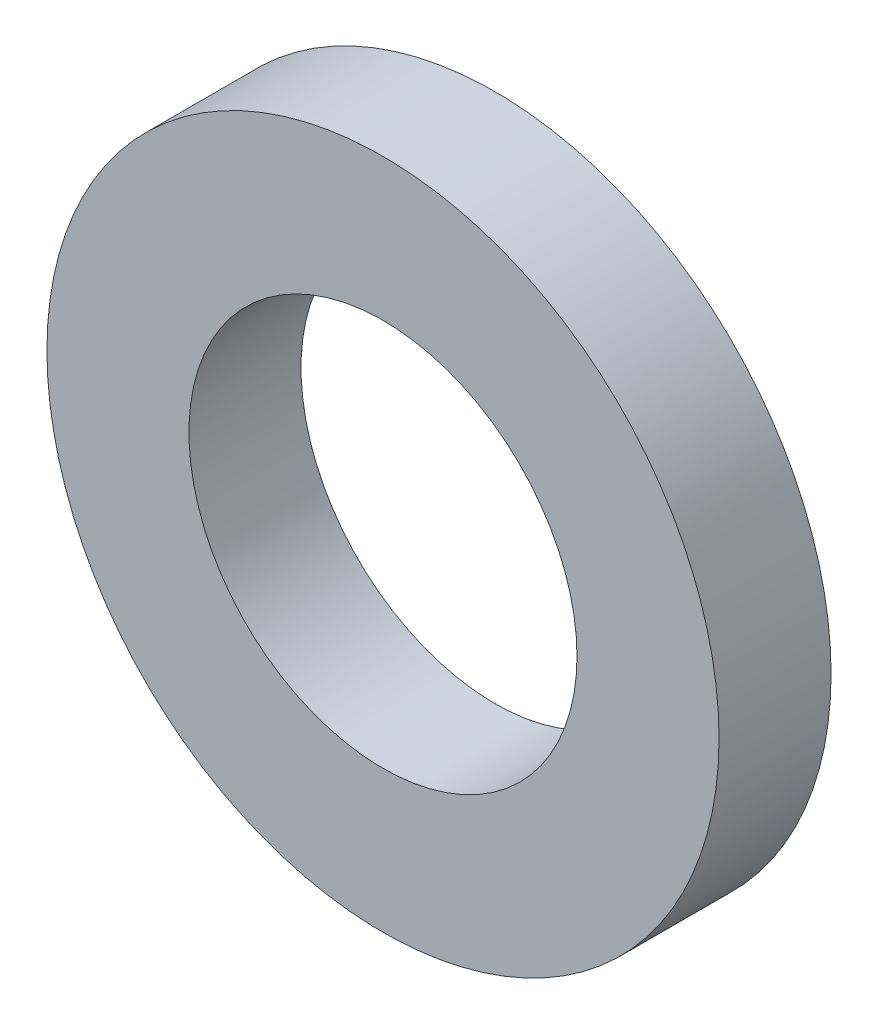
ISO-10303-21;
HEADER;
FILE_DESCRIPTION(('STEP AP214'),'2;1');
FILE_NAME('part.step','',(''),(''),'','','');
FILE_SCHEMA(('AUTOMOTIVE_DESIGN { 1 0 10303 214 1 1 1 1 }'));
ENDSEC;
DATA;
#1=APPLICATION_CONTEXT('core data for automotive mechanical design processes');
#2=APPLICATION_PROTOCOL_DEFINITION('international standard','automotive_design',2000,#1);
#3=PRODUCT_CONTEXT('',#1,'mechanical');
#4=PRODUCT('Part','Part','',(#3));
#5=PRODUCT_RELATED_PRODUCT_CATEGORY('part','',(#4));
#6=PRODUCT_DEFINITION_FORMATION('','',#4);
#7=PRODUCT_DEFINITION_CONTEXT('part definition',#1,'design');
#8=PRODUCT_DEFINITION('design','',#6,#7);
#9=PRODUCT_DEFINITION_SHAPE('','',#8);
#10=(LENGTH_UNIT() NAMED_UNIT(*) SI_UNIT(.MILLI.,.METRE.));
#11=(NAMED_UNIT(*) PLANE_ANGLE_UNIT() SI_UNIT($,.RADIAN.));
#12=(NAMED_UNIT(*) SI_UNIT($,.STERADIAN.) SOLID_ANGLE_UNIT());
#13=UNCERTAINTY_MEASURE_WITH_UNIT(LENGTH_MEASURE(1.E-05),#10,'distance_accuracy_value','');
#14=(GEOMETRIC_REPRESENTATION_CONTEXT(3) GLOBAL_UNCERTAINTY_ASSIGNED_CONTEXT((#13)) GLOBAL_UNIT_ASSIGNED_CONTEXT((#10,
#11,#12)) REPRESENTATION_CONTEXT('',''));
#15=CARTESIAN_POINT('',(0.,0.,0.));
#16=DIRECTION('',(0.,0.,1.));
#17=DIRECTION('',(1.,0.,0.));
#18=AXIS2_PLACEMENT_3D('',#15,#16,#17);
#19=CARTESIAN_POINT('',(0.,0.,3.175));
#20=DIRECTION('',(0.,0.,-1.));
#21=DIRECTION('',(-1.,0.,0.));
#22=AXIS2_PLACEMENT_3D('',#19,#20,#21);
#23=CYLINDRICAL_SURFACE('',#22,19.05);
#24=CARTESIAN_POINT('',(0.,0.,3.175));
#25=DIRECTION('',(0.,0.,1.));
#26=DIRECTION('',(1.,0.,0.));
#27=AXIS2_PLACEMENT_3D('',#24,#25,#26);
#28=CIRCLE('',#27,19.05);
#29=CARTESIAN_POINT('',(19.05,0.,3.175));
#30=VERTEX_POINT('',#29);
#31=EDGE_CURVE('E10',#30,#30,#28,.T.);
#32=ORIENTED_EDGE('',*,*,#31,.F.);
#33=EDGE_LOOP('',(#32));
#34=FACE_BOUND('',#33,.T.);
#35=CARTESIAN_POINT('',(0.,0.,-3.175));
#36=DIRECTION('',(0.,0.,1.));
#37=DIRECTION('',(1.,0.,0.));
#38=AXIS2_PLACEMENT_3D('',#35,#36,#37);
#39=CIRCLE('',#38,19.05);
#40=CARTESIAN_POINT('',(19.05,0.,-3.175));
#41=VERTEX_POINT('',#40);
#42=EDGE_CURVE('E51',#41,#41,#39,.T.);
#43=ORIENTED_EDGE('',*,*,#42,.T.);
#44=EDGE_LOOP('',(#43));
#45=FACE_BOUND('',#44,.T.);
#46=ADVANCED_FACE('F43',(#34,#45),#23,.T.);
#47=CARTESIAN_POINT('',(0.,0.,3.175));
#48=DIRECTION('',(0.,0.,1.));
#49=DIRECTION('',(1.,0.,0.));
#50=AXIS2_PLACEMENT_3D('',#47,#48,#49);
#51=PLANE('',#50);
#52=CARTESIAN_POINT('',(0.,0.,3.175));
#53=DIRECTION('',(0.,0.,1.));
#54=DIRECTION('',(1.,0.,0.));
#55=AXIS2_PLACEMENT_3D('',#52,#53,#54);
#56=CIRCLE('',#55,10.9982);
#57=CARTESIAN_POINT('',(10.9982,0.,3.175));
#58=VERTEX_POINT('',#57);
#59=EDGE_CURVE('E57',#58,#58,#56,.T.);
#60=ORIENTED_EDGE('',*,*,#59,.F.);
#61=EDGE_LOOP('',(#60));
#62=FACE_BOUND('',#61,.T.);
#63=ORIENTED_EDGE('',*,*,#31,.T.);
#64=EDGE_LOOP('',(#63));
#65=FACE_BOUND('',#64,.T.);
#66=ADVANCED_FACE('F76',(#62,#65),#51,.T.);
#67=CARTESIAN_POINT('',(0.,0.,-3.175));
#68=DIRECTION('',(0.,0.,1.));
#69=DIRECTION('',(1.,0.,0.));
#70=AXIS2_PLACEMENT_3D('',#67,#68,#69);
#71=PLANE('',#70);
#72=CARTESIAN_POINT('',(0.,0.,-3.175));
#73=DIRECTION('',(0.,0.,1.));
#74=DIRECTION('',(1.,0.,0.));
#75=AXIS2_PLACEMENT_3D('',#72,#73,#74);
#76=CIRCLE('',#75,10.9982);
#77=CARTESIAN_POINT('',(10.9982,0.,-3.175));
#78=VERTEX_POINT('',#77);
#79=EDGE_CURVE('E46',#78,#78,#76,.T.);
#80=ORIENTED_EDGE('',*,*,#79,.T.);
#81=EDGE_LOOP('',(#80));
#82=FACE_BOUND('',#81,.T.);
#83=ORIENTED_EDGE('',*,*,#42,.F.);
#84=EDGE_LOOP('',(#83));
#85=FACE_BOUND('',#84,.T.);
#86=ADVANCED_FACE('F67',(#82,#85),#71,.F.);
#87=CARTESIAN_POINT('',(0.,0.,-12.7));
#88=DIRECTION('',(0.,0.,1.));
#89=DIRECTION('',(1.,0.,0.));
#90=AXIS2_PLACEMENT_3D('',#87,#88,#89);
#91=CYLINDRICAL_SURFACE('',#90,10.9982);
#92=ORIENTED_EDGE('',*,*,#59,.T.);
#93=EDGE_LOOP('',(#92));
#94=FACE_BOUND('',#93,.T.);
#95=ORIENTED_EDGE('',*,*,#79,.F.);
#96=EDGE_LOOP('',(#95));
#97=FACE_BOUND('',#96,.T.);
#98=ADVANCED_FACE('F70',(#94,#97),#91,.F.);
#99=CLOSED_SHELL('',(#46,#66,#86,#98));
#100=MANIFOLD_SOLID_BREP('B2',#99);
#101=ADVANCED_BREP_SHAPE_REPRESENTATION('',(#18,#100),#14);
#102=SHAPE_DEFINITION_REPRESENTATION(#9,#101);
ENDSEC;
END-ISO-10303-21;
